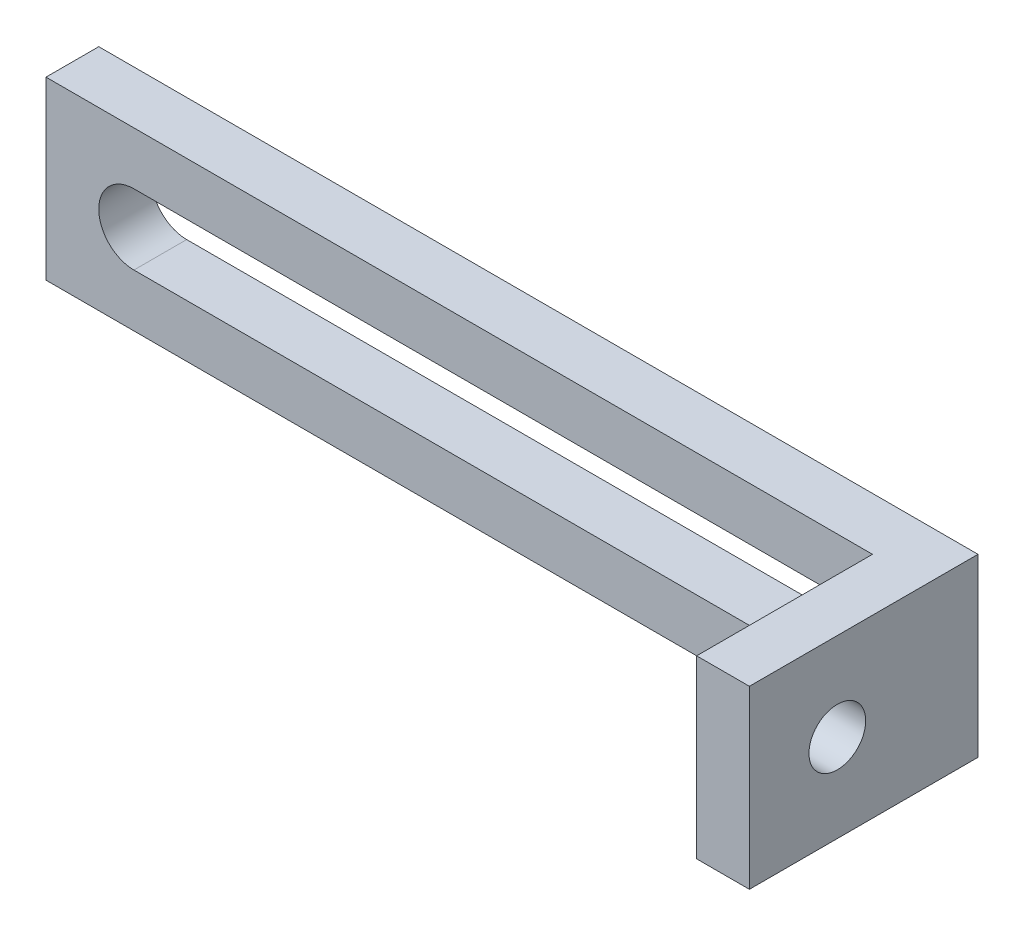
ISO-10303-21;
HEADER;
FILE_DESCRIPTION(('STEP AP214'),'2;1');
FILE_NAME('part.step','',(''),(''),'','','');
FILE_SCHEMA(('AUTOMOTIVE_DESIGN { 1 0 10303 214 1 1 1 1 }'));
ENDSEC;
DATA;
#1=APPLICATION_CONTEXT('core data for automotive mechanical design processes');
#2=APPLICATION_PROTOCOL_DEFINITION('international standard','automotive_design',2000,#1);
#3=PRODUCT_CONTEXT('',#1,'mechanical');
#4=PRODUCT('Part','Part','',(#3));
#5=PRODUCT_RELATED_PRODUCT_CATEGORY('part','',(#4));
#6=PRODUCT_DEFINITION_FORMATION('','',#4);
#7=PRODUCT_DEFINITION_CONTEXT('part definition',#1,'design');
#8=PRODUCT_DEFINITION('design','',#6,#7);
#9=PRODUCT_DEFINITION_SHAPE('','',#8);
#10=(LENGTH_UNIT() NAMED_UNIT(*) SI_UNIT(.MILLI.,.METRE.));
#11=(NAMED_UNIT(*) PLANE_ANGLE_UNIT() SI_UNIT($,.RADIAN.));
#12=(NAMED_UNIT(*) SI_UNIT($,.STERADIAN.) SOLID_ANGLE_UNIT());
#13=UNCERTAINTY_MEASURE_WITH_UNIT(LENGTH_MEASURE(1.E-05),#10,'distance_accuracy_value','');
#14=(GEOMETRIC_REPRESENTATION_CONTEXT(3) GLOBAL_UNCERTAINTY_ASSIGNED_CONTEXT((#13)) GLOBAL_UNIT_ASSIGNED_CONTEXT((#10,
#11,#12)) REPRESENTATION_CONTEXT('',''));
#15=CARTESIAN_POINT('',(0.,0.,0.));
#16=DIRECTION('',(0.,0.,1.));
#17=DIRECTION('',(1.,0.,0.));
#18=AXIS2_PLACEMENT_3D('',#15,#16,#17);
#19=CARTESIAN_POINT('',(25.,5.,3.));
#20=DIRECTION('',(-1.,0.,0.));
#21=DIRECTION('',(0.,0.,1.));
#22=AXIS2_PLACEMENT_3D('',#19,#20,#21);
#23=PLANE('',#22);
#24=CARTESIAN_POINT('',(25.,0.,8.));
#25=DIRECTION('',(1.,0.,0.));
#26=DIRECTION('',(0.,0.,-1.));
#27=AXIS2_PLACEMENT_3D('',#24,#25,#26);
#28=CIRCLE('',#27,1.61444520199689);
#29=CARTESIAN_POINT('',(25.,0.,6.38555479800312));
#30=VERTEX_POINT('',#29);
#31=EDGE_CURVE('E180',#30,#30,#28,.T.);
#32=ORIENTED_EDGE('',*,*,#31,.F.);
#33=EDGE_LOOP('',(#32));
#34=FACE_BOUND('',#33,.T.);
#35=DIRECTION('',(0.,1.,0.));
#36=VECTOR('',#35,1.);
#37=CARTESIAN_POINT('',(25.,5.,0.));
#38=LINE('',#37,#36);
#39=CARTESIAN_POINT('',(25.,-5.,0.));
#40=VERTEX_POINT('',#39);
#41=CARTESIAN_POINT('',(25.,5.,0.));
#42=VERTEX_POINT('',#41);
#43=EDGE_CURVE('E204',#40,#42,#38,.T.);
#44=ORIENTED_EDGE('',*,*,#43,.T.);
#45=DIRECTION('',(0.,0.,-1.));
#46=VECTOR('',#45,1.);
#47=CARTESIAN_POINT('',(25.,5.,3.));
#48=LINE('',#47,#46);
#49=CARTESIAN_POINT('',(25.,5.,13.));
#50=VERTEX_POINT('',#49);
#51=EDGE_CURVE('E229',#50,#42,#48,.T.);
#52=ORIENTED_EDGE('',*,*,#51,.F.);
#53=DIRECTION('',(0.,1.,0.));
#54=VECTOR('',#53,1.);
#55=CARTESIAN_POINT('',(25.,5.,13.));
#56=LINE('',#55,#54);
#57=CARTESIAN_POINT('',(25.,-5.,13.));
#58=VERTEX_POINT('',#57);
#59=EDGE_CURVE('E184',#58,#50,#56,.T.);
#60=ORIENTED_EDGE('',*,*,#59,.F.);
#61=DIRECTION('',(0.,0.,-1.));
#62=VECTOR('',#61,1.);
#63=CARTESIAN_POINT('',(25.,-5.,3.));
#64=LINE('',#63,#62);
#65=EDGE_CURVE('E213',#58,#40,#64,.T.);
#66=ORIENTED_EDGE('',*,*,#65,.T.);
#67=EDGE_LOOP('',(#44,#52,#60,#66));
#68=FACE_BOUND('',#67,.T.);
#69=ADVANCED_FACE('F34',(#34,#68),#23,.F.);
#70=CARTESIAN_POINT('',(-25.,5.,3.));
#71=DIRECTION('',(0.,-1.,0.));
#72=DIRECTION('',(0.,0.,-1.));
#73=AXIS2_PLACEMENT_3D('',#70,#71,#72);
#74=PLANE('',#73);
#75=DIRECTION('',(-1.,0.,0.));
#76=VECTOR('',#75,1.);
#77=CARTESIAN_POINT('',(-25.,5.,0.));
#78=LINE('',#77,#76);
#79=CARTESIAN_POINT('',(-25.,5.,0.));
#80=VERTEX_POINT('',#79);
#81=EDGE_CURVE('E216',#42,#80,#78,.T.);
#82=ORIENTED_EDGE('',*,*,#81,.T.);
#83=DIRECTION('',(0.,0.,-1.));
#84=VECTOR('',#83,1.);
#85=CARTESIAN_POINT('',(-25.,5.,3.));
#86=LINE('',#85,#84);
#87=CARTESIAN_POINT('',(-25.,5.,3.));
#88=VERTEX_POINT('',#87);
#89=EDGE_CURVE('E226',#88,#80,#86,.T.);
#90=ORIENTED_EDGE('',*,*,#89,.F.);
#91=DIRECTION('',(-1.,0.,0.));
#92=VECTOR('',#91,1.);
#93=CARTESIAN_POINT('',(-25.,5.,3.));
#94=LINE('',#93,#92);
#95=CARTESIAN_POINT('',(22.,5.,3.));
#96=VERTEX_POINT('',#95);
#97=EDGE_CURVE('E205',#96,#88,#94,.T.);
#98=ORIENTED_EDGE('',*,*,#97,.F.);
#99=DIRECTION('',(0.,0.,-1.));
#100=VECTOR('',#99,1.);
#101=CARTESIAN_POINT('',(22.,5.,13.));
#102=LINE('',#101,#100);
#103=CARTESIAN_POINT('',(22.,5.,13.));
#104=VERTEX_POINT('',#103);
#105=EDGE_CURVE('E201',#104,#96,#102,.T.);
#106=ORIENTED_EDGE('',*,*,#105,.F.);
#107=DIRECTION('',(-1.,0.,0.));
#108=VECTOR('',#107,1.);
#109=CARTESIAN_POINT('',(25.,5.,13.));
#110=LINE('',#109,#108);
#111=EDGE_CURVE('E187',#50,#104,#110,.T.);
#112=ORIENTED_EDGE('',*,*,#111,.F.);
#113=ORIENTED_EDGE('',*,*,#51,.T.);
#114=EDGE_LOOP('',(#82,#90,#98,#106,#112,#113));
#115=FACE_BOUND('',#114,.T.);
#116=ADVANCED_FACE('F270',(#115),#74,.F.);
#117=CARTESIAN_POINT('',(-25.,5.,3.));
#118=DIRECTION('',(1.,0.,0.));
#119=DIRECTION('',(0.,0.,-1.));
#120=AXIS2_PLACEMENT_3D('',#117,#118,#119);
#121=PLANE('',#120);
#122=DIRECTION('',(0.,-1.,0.));
#123=VECTOR('',#122,1.);
#124=CARTESIAN_POINT('',(-25.,5.,0.));
#125=LINE('',#124,#123);
#126=CARTESIAN_POINT('',(-25.,-5.,0.));
#127=VERTEX_POINT('',#126);
#128=EDGE_CURVE('E218',#80,#127,#125,.T.);
#129=ORIENTED_EDGE('',*,*,#128,.T.);
#130=DIRECTION('',(0.,0.,-1.));
#131=VECTOR('',#130,1.);
#132=CARTESIAN_POINT('',(-25.,-5.,3.));
#133=LINE('',#132,#131);
#134=CARTESIAN_POINT('',(-25.,-5.,3.));
#135=VERTEX_POINT('',#134);
#136=EDGE_CURVE('E223',#135,#127,#133,.T.);
#137=ORIENTED_EDGE('',*,*,#136,.F.);
#138=DIRECTION('',(0.,-1.,0.));
#139=VECTOR('',#138,1.);
#140=CARTESIAN_POINT('',(-25.,5.,3.));
#141=LINE('',#140,#139);
#142=EDGE_CURVE('E207',#88,#135,#141,.T.);
#143=ORIENTED_EDGE('',*,*,#142,.F.);
#144=ORIENTED_EDGE('',*,*,#89,.T.);
#145=EDGE_LOOP('',(#129,#137,#143,#144));
#146=FACE_BOUND('',#145,.T.);
#147=ADVANCED_FACE('F275',(#146),#121,.F.);
#148=CARTESIAN_POINT('',(-25.,-5.,3.));
#149=DIRECTION('',(0.,1.,0.));
#150=DIRECTION('',(0.,0.,1.));
#151=AXIS2_PLACEMENT_3D('',#148,#149,#150);
#152=PLANE('',#151);
#153=DIRECTION('',(1.,0.,0.));
#154=VECTOR('',#153,1.);
#155=CARTESIAN_POINT('',(-25.,-5.,0.));
#156=LINE('',#155,#154);
#157=EDGE_CURVE('E208',#127,#40,#156,.T.);
#158=ORIENTED_EDGE('',*,*,#157,.T.);
#159=ORIENTED_EDGE('',*,*,#65,.F.);
#160=DIRECTION('',(1.,0.,0.));
#161=VECTOR('',#160,1.);
#162=CARTESIAN_POINT('',(25.,-5.,13.));
#163=LINE('',#162,#161);
#164=CARTESIAN_POINT('',(22.,-5.,13.));
#165=VERTEX_POINT('',#164);
#166=EDGE_CURVE('E192',#165,#58,#163,.T.);
#167=ORIENTED_EDGE('',*,*,#166,.F.);
#168=DIRECTION('',(0.,0.,-1.));
#169=VECTOR('',#168,1.);
#170=CARTESIAN_POINT('',(22.,-5.,13.));
#171=LINE('',#170,#169);
#172=CARTESIAN_POINT('',(22.,-5.,3.));
#173=VERTEX_POINT('',#172);
#174=EDGE_CURVE('E195',#165,#173,#171,.T.);
#175=ORIENTED_EDGE('',*,*,#174,.T.);
#176=DIRECTION('',(1.,0.,0.));
#177=VECTOR('',#176,1.);
#178=CARTESIAN_POINT('',(-25.,-5.,3.));
#179=LINE('',#178,#177);
#180=EDGE_CURVE('E210',#135,#173,#179,.T.);
#181=ORIENTED_EDGE('',*,*,#180,.F.);
#182=ORIENTED_EDGE('',*,*,#136,.T.);
#183=EDGE_LOOP('',(#158,#159,#167,#175,#181,#182));
#184=FACE_BOUND('',#183,.T.);
#185=ADVANCED_FACE('F293',(#184),#152,.F.);
#186=CARTESIAN_POINT('',(0.,0.,3.));
#187=DIRECTION('',(0.,0.,1.));
#188=DIRECTION('',(1.,0.,0.));
#189=AXIS2_PLACEMENT_3D('',#186,#187,#188);
#190=PLANE('',#189);
#191=CARTESIAN_POINT('',(20.3063586632031,0.,3.));
#192=DIRECTION('',(0.,0.,1.));
#193=DIRECTION('',(1.,0.,0.));
#194=AXIS2_PLACEMENT_3D('',#191,#192,#193);
#195=CIRCLE('',#194,2.);
#196=CARTESIAN_POINT('',(20.3063586632031,-2.00000000000001,3.));
#197=VERTEX_POINT('',#196);
#198=CARTESIAN_POINT('',(22.,-1.06375703160684,3.));
#199=VERTEX_POINT('',#198);
#200=EDGE_CURVE('E173',#197,#199,#195,.T.);
#201=ORIENTED_EDGE('',*,*,#200,.F.);
#202=DIRECTION('',(1.,0.,0.));
#203=VECTOR('',#202,1.);
#204=CARTESIAN_POINT('',(0.,-2.,3.));
#205=LINE('',#204,#203);
#206=CARTESIAN_POINT('',(-20.,-2.,3.));
#207=VERTEX_POINT('',#206);
#208=EDGE_CURVE('E176',#207,#197,#205,.T.);
#209=ORIENTED_EDGE('',*,*,#208,.F.);
#210=CARTESIAN_POINT('',(-20.,0.,3.));
#211=DIRECTION('',(0.,0.,1.));
#212=DIRECTION('',(1.,0.,0.));
#213=AXIS2_PLACEMENT_3D('',#210,#211,#212);
#214=CIRCLE('',#213,2.);
#215=CARTESIAN_POINT('',(-20.,2.,3.));
#216=VERTEX_POINT('',#215);
#217=EDGE_CURVE('E178',#216,#207,#214,.T.);
#218=ORIENTED_EDGE('',*,*,#217,.F.);
#219=DIRECTION('',(-1.,0.,0.));
#220=VECTOR('',#219,1.);
#221=CARTESIAN_POINT('',(0.,2.,3.));
#222=LINE('',#221,#220);
#223=CARTESIAN_POINT('',(20.3063586632031,1.99999999999999,3.));
#224=VERTEX_POINT('',#223);
#225=EDGE_CURVE('E174',#224,#216,#222,.T.);
#226=ORIENTED_EDGE('',*,*,#225,.F.);
#227=CARTESIAN_POINT('',(22.,1.06375703160682,3.));
#228=VERTEX_POINT('',#227);
#229=EDGE_CURVE('E141',#228,#224,#195,.T.);
#230=ORIENTED_EDGE('',*,*,#229,.F.);
#231=DIRECTION('',(0.,-1.,0.));
#232=VECTOR('',#231,1.);
#233=CARTESIAN_POINT('',(22.,5.,3.));
#234=LINE('',#233,#232);
#235=EDGE_CURVE('E188',#96,#228,#234,.T.);
#236=ORIENTED_EDGE('',*,*,#235,.F.);
#237=ORIENTED_EDGE('',*,*,#97,.T.);
#238=ORIENTED_EDGE('',*,*,#142,.T.);
#239=ORIENTED_EDGE('',*,*,#180,.T.);
#240=EDGE_CURVE('E198',#199,#173,#234,.T.);
#241=ORIENTED_EDGE('',*,*,#240,.F.);
#242=EDGE_LOOP('',(#201,#209,#218,#226,#230,#236,#237,#238,#239,#241));
#243=FACE_BOUND('',#242,.T.);
#244=ADVANCED_FACE('F305',(#243),#190,.T.);
#245=CARTESIAN_POINT('',(0.,0.,0.));
#246=DIRECTION('',(0.,0.,1.));
#247=DIRECTION('',(1.,0.,0.));
#248=AXIS2_PLACEMENT_3D('',#245,#246,#247);
#249=PLANE('',#248);
#250=DIRECTION('',(1.,0.,0.));
#251=VECTOR('',#250,1.);
#252=CARTESIAN_POINT('',(-20.,2.,0.));
#253=LINE('',#252,#251);
#254=CARTESIAN_POINT('',(-20.,2.,0.));
#255=VERTEX_POINT('',#254);
#256=CARTESIAN_POINT('',(20.3063586632031,1.99999999999999,0.));
#257=VERTEX_POINT('',#256);
#258=EDGE_CURVE('E148',#255,#257,#253,.T.);
#259=ORIENTED_EDGE('',*,*,#258,.F.);
#260=CARTESIAN_POINT('',(-20.,0.,0.));
#261=DIRECTION('',(0.,0.,-1.));
#262=DIRECTION('',(-1.,0.,0.));
#263=AXIS2_PLACEMENT_3D('',#260,#261,#262);
#264=CIRCLE('',#263,2.);
#265=CARTESIAN_POINT('',(-20.,-2.,0.));
#266=VERTEX_POINT('',#265);
#267=EDGE_CURVE('E48',#266,#255,#264,.T.);
#268=ORIENTED_EDGE('',*,*,#267,.F.);
#269=DIRECTION('',(-1.,0.,0.));
#270=VECTOR('',#269,1.);
#271=CARTESIAN_POINT('',(-20.,-2.,0.));
#272=LINE('',#271,#270);
#273=CARTESIAN_POINT('',(20.3063586632031,-2.00000000000001,0.));
#274=VERTEX_POINT('',#273);
#275=EDGE_CURVE('E155',#274,#266,#272,.T.);
#276=ORIENTED_EDGE('',*,*,#275,.F.);
#277=CARTESIAN_POINT('',(20.3063586632031,0.,0.));
#278=DIRECTION('',(0.,0.,-1.));
#279=DIRECTION('',(-1.,0.,0.));
#280=AXIS2_PLACEMENT_3D('',#277,#278,#279);
#281=CIRCLE('',#280,2.);
#282=EDGE_CURVE('E138',#257,#274,#281,.T.);
#283=ORIENTED_EDGE('',*,*,#282,.F.);
#284=EDGE_LOOP('',(#259,#268,#276,#283));
#285=FACE_BOUND('',#284,.T.);
#286=ORIENTED_EDGE('',*,*,#43,.F.);
#287=ORIENTED_EDGE('',*,*,#157,.F.);
#288=ORIENTED_EDGE('',*,*,#128,.F.);
#289=ORIENTED_EDGE('',*,*,#81,.F.);
#290=EDGE_LOOP('',(#286,#287,#288,#289));
#291=FACE_BOUND('',#290,.T.);
#292=ADVANCED_FACE('F152',(#285,#291),#249,.F.);
#293=CARTESIAN_POINT('',(22.,5.,13.));
#294=DIRECTION('',(1.,0.,0.));
#295=DIRECTION('',(0.,1.,0.));
#296=AXIS2_PLACEMENT_3D('',#293,#294,#295);
#297=PLANE('',#296);
#298=CARTESIAN_POINT('',(22.,0.,8.));
#299=DIRECTION('',(1.,0.,0.));
#300=DIRECTION('',(0.,1.,0.));
#301=AXIS2_PLACEMENT_3D('',#298,#299,#300);
#302=CIRCLE('',#301,1.61444520199689);
#303=CARTESIAN_POINT('',(22.,-1.06375703160684,9.21443578996906));
#304=VERTEX_POINT('',#303);
#305=CARTESIAN_POINT('',(22.,-1.06375703160684,6.78556421003094));
#306=VERTEX_POINT('',#305);
#307=EDGE_CURVE('E235',#304,#306,#302,.T.);
#308=ORIENTED_EDGE('',*,*,#307,.T.);
#309=DIRECTION('',(0.,0.,-1.));
#310=VECTOR('',#309,1.);
#311=CARTESIAN_POINT('',(22.,-1.06375703160684,10.));
#312=LINE('',#311,#310);
#313=EDGE_CURVE('E56',#306,#199,#312,.T.);
#314=ORIENTED_EDGE('',*,*,#313,.T.);
#315=ORIENTED_EDGE('',*,*,#240,.T.);
#316=ORIENTED_EDGE('',*,*,#174,.F.);
#317=DIRECTION('',(0.,-1.,0.));
#318=VECTOR('',#317,1.);
#319=CARTESIAN_POINT('',(22.,5.,13.));
#320=LINE('',#319,#318);
#321=EDGE_CURVE('E190',#104,#165,#320,.T.);
#322=ORIENTED_EDGE('',*,*,#321,.F.);
#323=ORIENTED_EDGE('',*,*,#105,.T.);
#324=ORIENTED_EDGE('',*,*,#235,.T.);
#325=DIRECTION('',(0.,0.,-1.));
#326=VECTOR('',#325,1.);
#327=CARTESIAN_POINT('',(22.,1.06375703160682,10.));
#328=LINE('',#327,#326);
#329=CARTESIAN_POINT('',(22.,1.06375703160683,6.78556421003093));
#330=VERTEX_POINT('',#329);
#331=EDGE_CURVE('E169',#228,#330,#328,.F.);
#332=ORIENTED_EDGE('',*,*,#331,.T.);
#333=CARTESIAN_POINT('',(22.,1.06375703160682,9.21443578996907));
#334=VERTEX_POINT('',#333);
#335=EDGE_CURVE('E183',#330,#334,#302,.T.);
#336=ORIENTED_EDGE('',*,*,#335,.T.);
#337=CARTESIAN_POINT('',(22.,1.06375703160682,10.));
#338=VERTEX_POINT('',#337);
#339=EDGE_CURVE('E163',#334,#338,#328,.F.);
#340=ORIENTED_EDGE('',*,*,#339,.T.);
#341=DIRECTION('',(0.,1.,0.));
#342=VECTOR('',#341,1.);
#343=CARTESIAN_POINT('',(22.,5.,10.));
#344=LINE('',#343,#342);
#345=CARTESIAN_POINT('',(22.,-1.06375703160683,10.));
#346=VERTEX_POINT('',#345);
#347=EDGE_CURVE('E11',#346,#338,#344,.T.);
#348=ORIENTED_EDGE('',*,*,#347,.F.);
#349=EDGE_CURVE('E168',#346,#304,#312,.T.);
#350=ORIENTED_EDGE('',*,*,#349,.T.);
#351=EDGE_LOOP('',(#308,#314,#315,#316,#322,#323,#324,#332,#336,#340,#348,#350));
#352=FACE_BOUND('',#351,.T.);
#353=ADVANCED_FACE('F301',(#352),#297,.F.);
#354=CARTESIAN_POINT('',(0.,0.,13.));
#355=DIRECTION('',(0.,0.,-1.));
#356=DIRECTION('',(-1.,0.,0.));
#357=AXIS2_PLACEMENT_3D('',#354,#355,#356);
#358=PLANE('',#357);
#359=ORIENTED_EDGE('',*,*,#59,.T.);
#360=ORIENTED_EDGE('',*,*,#111,.T.);
#361=ORIENTED_EDGE('',*,*,#321,.T.);
#362=ORIENTED_EDGE('',*,*,#166,.T.);
#363=EDGE_LOOP('',(#359,#360,#361,#362));
#364=FACE_BOUND('',#363,.T.);
#365=ADVANCED_FACE('F289',(#364),#358,.F.);
#366=CARTESIAN_POINT('',(15.,0.,8.));
#367=DIRECTION('',(1.,0.,0.));
#368=DIRECTION('',(0.,0.,-1.));
#369=AXIS2_PLACEMENT_3D('',#366,#367,#368);
#370=CYLINDRICAL_SURFACE('',#369,1.61444520199689);
#371=ORIENTED_EDGE('',*,*,#31,.T.);
#372=EDGE_LOOP('',(#371));
#373=FACE_BOUND('',#372,.T.);
#374=ORIENTED_EDGE('',*,*,#335,.F.);
#375=CARTESIAN_POINT('',(22.,1.06375703160683,6.78556421003093));
#376=CARTESIAN_POINT('',(22.0188032996192,1.03381779376546,6.75934658014459));
#377=CARTESIAN_POINT('',(22.0371932865215,1.00277613514509,6.73410685869977));
#378=CARTESIAN_POINT('',(22.0728924472153,0.938464249355861,6.68571504199958));
#379=CARTESIAN_POINT('',(22.0902005090884,0.905191800019928,6.66256508393479));
#380=CARTESIAN_POINT('',(22.1403372994411,0.801520718467143,6.59616221636716));
#381=CARTESIAN_POINT('',(22.1710593589866,0.727762023153986,6.5563941620353));
#382=CARTESIAN_POINT('',(22.224611011303,0.571955829906876,6.48785433016536));
#383=CARTESIAN_POINT('',(22.2473889481113,0.489858406041804,6.45915439912254));
#384=CARTESIAN_POINT('',(22.2824293375989,0.320277688968936,6.41523955628508));
#385=CARTESIAN_POINT('',(22.2947384398989,0.232820170648809,6.39996481094056));
#386=CARTESIAN_POINT('',(22.306663614611,0.0680807695746305,6.38517276977889));
#387=CARTESIAN_POINT('',(22.307806587024,-0.00892516031450702,6.3837598238655));
#388=CARTESIAN_POINT('',(22.3012570572439,-0.162002031900135,6.39187711757424));
#389=CARTESIAN_POINT('',(22.2935621382524,-0.238072712093832,6.40141035052433));
#390=CARTESIAN_POINT('',(22.2708955628558,-0.381423778340448,6.42968040637981));
#391=CARTESIAN_POINT('',(22.2564930947699,-0.448941298222054,6.44769837353341));
#392=CARTESIAN_POINT('',(22.2216762135911,-0.579786555494483,6.49167223706617));
#393=CARTESIAN_POINT('',(22.2012525554064,-0.643107665127184,6.51764034266953));
#394=CARTESIAN_POINT('',(22.153329166256,-0.77057257895244,6.57938054355527));
#395=CARTESIAN_POINT('',(22.1253283470637,-0.834174393818409,6.61586984209543));
#396=CARTESIAN_POINT('',(22.0652923147667,-0.954290737378084,6.69579873443961));
#397=CARTESIAN_POINT('',(22.0332766104008,-1.01083706343202,6.73920497706659));
#398=CARTESIAN_POINT('',(22.,-1.06375703160684,6.78556421003094));
#399=B_SPLINE_CURVE_WITH_KNOTS('',3,(#375,#376,#377,#378,#379,#380,#381,#382,#383,#384,#385,
#386,#387,#388,#389,#390,#391,#392,#393,#394,#395,#396,#397,#398),.UNSPECIFIED.,.F.,.F.,(4,2,2,
2,2,2,2,2,2,2,2,4),(0.,0.131991413518058,0.264116319878657,0.530542743696974,0.798670624341733,
1.06559735932172,1.29540996218965,1.52528542428574,1.73846264141166,1.95196889639105,
2.18666370612377,2.42025935264319),.UNSPECIFIED.);
#400=EDGE_CURVE('E41',#330,#306,#399,.T.);
#401=ORIENTED_EDGE('',*,*,#400,.T.);
#402=ORIENTED_EDGE('',*,*,#307,.F.);
#403=CARTESIAN_POINT('',(22.,-1.06375703160684,9.21443578996906));
#404=CARTESIAN_POINT('',(22.0188032996192,-1.03381779376547,9.2406534198554));
#405=CARTESIAN_POINT('',(22.0371932865215,-1.0027761351451,9.26589314130023));
#406=CARTESIAN_POINT('',(22.0728924472153,-0.938464249355872,9.31428495800041));
#407=CARTESIAN_POINT('',(22.0902005090884,-0.905191800019939,9.3374349160652));
#408=CARTESIAN_POINT('',(22.1403372994411,-0.801520718467154,9.40383778363283));
#409=CARTESIAN_POINT('',(22.1710593589866,-0.727762023153998,9.4436058379647));
#410=CARTESIAN_POINT('',(22.224611011303,-0.571955829906889,9.51214566983463));
#411=CARTESIAN_POINT('',(22.2473889481113,-0.489858406041817,9.54084560087746));
#412=CARTESIAN_POINT('',(22.2824293375989,-0.320277688968949,9.58476044371492));
#413=CARTESIAN_POINT('',(22.2947384398989,-0.232820170648822,9.60003518905944));
#414=CARTESIAN_POINT('',(22.306663614611,-0.0680807695746423,9.61482723022111));
#415=CARTESIAN_POINT('',(22.307806587024,0.00892516031449546,9.6162401761345));
#416=CARTESIAN_POINT('',(22.3012570572439,0.162002031900123,9.60812288242576));
#417=CARTESIAN_POINT('',(22.2935621382524,0.238072712093821,9.59858964947567));
#418=CARTESIAN_POINT('',(22.2708955628558,0.381423778340438,9.57031959362019));
#419=CARTESIAN_POINT('',(22.2564930947699,0.448941298222045,9.55230162646659));
#420=CARTESIAN_POINT('',(22.2216762135911,0.579786555494474,9.50832776293384));
#421=CARTESIAN_POINT('',(22.2012525554064,0.643107665127174,9.48235965733047));
#422=CARTESIAN_POINT('',(22.153329166256,0.770572578952429,9.42061945644474));
#423=CARTESIAN_POINT('',(22.1253283470637,0.834174393818398,9.38413015790457));
#424=CARTESIAN_POINT('',(22.0652923147667,0.954290737378073,9.30420126556039));
#425=CARTESIAN_POINT('',(22.0332766104008,1.01083706343201,9.26079502293342));
#426=CARTESIAN_POINT('',(22.,1.06375703160683,9.21443578996907));
#427=B_SPLINE_CURVE_WITH_KNOTS('',3,(#403,#404,#405,#406,#407,#408,#409,#410,#411,#412,#413,
#414,#415,#416,#417,#418,#419,#420,#421,#422,#423,#424,#425,#426),.UNSPECIFIED.,.F.,.F.,(4,2,2,
2,2,2,2,2,2,2,2,4),(0.,0.131991413518059,0.264116319878659,0.530542743696976,0.798670624341734,
1.06559735932172,1.29540996218965,1.52528542428575,1.73846264141167,1.95196889639105,
2.18666370612377,2.42025935264319),.UNSPECIFIED.);
#428=EDGE_CURVE('E232',#304,#334,#427,.T.);
#429=ORIENTED_EDGE('',*,*,#428,.T.);
#430=EDGE_LOOP('',(#374,#401,#402,#429));
#431=FACE_BOUND('',#430,.T.);
#432=ADVANCED_FACE('F247',(#373,#431),#370,.F.);
#433=CARTESIAN_POINT('',(20.3063586632031,0.,10.));
#434=DIRECTION('',(0.,0.,-1.));
#435=DIRECTION('',(-1.,0.,0.));
#436=AXIS2_PLACEMENT_3D('',#433,#434,#435);
#437=CYLINDRICAL_SURFACE('',#436,2.);
#438=CARTESIAN_POINT('',(20.3063586632031,0.,10.));
#439=DIRECTION('',(0.,0.,-1.));
#440=DIRECTION('',(-1.,0.,0.));
#441=AXIS2_PLACEMENT_3D('',#438,#439,#440);
#442=CIRCLE('',#441,2.);
#443=EDGE_CURVE('E157',#338,#346,#442,.T.);
#444=ORIENTED_EDGE('',*,*,#443,.F.);
#445=ORIENTED_EDGE('',*,*,#339,.F.);
#446=ORIENTED_EDGE('',*,*,#428,.F.);
#447=ORIENTED_EDGE('',*,*,#349,.F.);
#448=EDGE_LOOP('',(#444,#445,#446,#447));
#449=FACE_BOUND('',#448,.T.);
#450=ADVANCED_FACE('F256',(#449),#437,.F.);
#451=CARTESIAN_POINT('',(-20.,0.,10.));
#452=DIRECTION('',(0.,0.,-1.));
#453=DIRECTION('',(-1.,0.,0.));
#454=AXIS2_PLACEMENT_3D('',#451,#452,#453);
#455=PLANE('',#454);
#456=ORIENTED_EDGE('',*,*,#347,.T.);
#457=ORIENTED_EDGE('',*,*,#443,.T.);
#458=EDGE_LOOP('',(#456,#457));
#459=FACE_BOUND('',#458,.T.);
#460=ADVANCED_FACE('F262',(#459),#455,.T.);
#461=CARTESIAN_POINT('',(-20.,0.,10.));
#462=DIRECTION('',(0.,0.,-1.));
#463=DIRECTION('',(-1.,0.,0.));
#464=AXIS2_PLACEMENT_3D('',#461,#462,#463);
#465=CYLINDRICAL_SURFACE('',#464,2.);
#466=ORIENTED_EDGE('',*,*,#217,.T.);
#467=DIRECTION('',(0.,0.,-1.));
#468=VECTOR('',#467,1.);
#469=CARTESIAN_POINT('',(-20.,-2.,10.));
#470=LINE('',#469,#468);
#471=EDGE_CURVE('E161',#207,#266,#470,.T.);
#472=ORIENTED_EDGE('',*,*,#471,.T.);
#473=ORIENTED_EDGE('',*,*,#267,.T.);
#474=DIRECTION('',(0.,0.,-1.));
#475=VECTOR('',#474,1.);
#476=CARTESIAN_POINT('',(-20.,2.,10.));
#477=LINE('',#476,#475);
#478=EDGE_CURVE('E145',#216,#255,#477,.T.);
#479=ORIENTED_EDGE('',*,*,#478,.F.);
#480=EDGE_LOOP('',(#466,#472,#473,#479));
#481=FACE_BOUND('',#480,.T.);
#482=ADVANCED_FACE('F260',(#481),#465,.F.);
#483=CARTESIAN_POINT('',(-20.,-2.,10.));
#484=DIRECTION('',(0.,-1.,0.));
#485=DIRECTION('',(1.,0.,0.));
#486=AXIS2_PLACEMENT_3D('',#483,#484,#485);
#487=PLANE('',#486);
#488=ORIENTED_EDGE('',*,*,#208,.T.);
#489=DIRECTION('',(0.,0.,-1.));
#490=VECTOR('',#489,1.);
#491=CARTESIAN_POINT('',(20.3063586632031,-2.00000000000001,10.));
#492=LINE('',#491,#490);
#493=EDGE_CURVE('E144',#197,#274,#492,.T.);
#494=ORIENTED_EDGE('',*,*,#493,.T.);
#495=ORIENTED_EDGE('',*,*,#275,.T.);
#496=ORIENTED_EDGE('',*,*,#471,.F.);
#497=EDGE_LOOP('',(#488,#494,#495,#496));
#498=FACE_BOUND('',#497,.T.);
#499=ADVANCED_FACE('F255',(#498),#487,.F.);
#500=ORIENTED_EDGE('',*,*,#200,.T.);
#501=ORIENTED_EDGE('',*,*,#313,.F.);
#502=ORIENTED_EDGE('',*,*,#400,.F.);
#503=ORIENTED_EDGE('',*,*,#331,.F.);
#504=ORIENTED_EDGE('',*,*,#229,.T.);
#505=DIRECTION('',(0.,0.,-1.));
#506=VECTOR('',#505,1.);
#507=CARTESIAN_POINT('',(20.3063586632031,1.99999999999999,10.));
#508=LINE('',#507,#506);
#509=EDGE_CURVE('E133',#224,#257,#508,.T.);
#510=ORIENTED_EDGE('',*,*,#509,.T.);
#511=ORIENTED_EDGE('',*,*,#282,.T.);
#512=ORIENTED_EDGE('',*,*,#493,.F.);
#513=EDGE_LOOP('',(#500,#501,#502,#503,#504,#510,#511,#512));
#514=FACE_BOUND('',#513,.T.);
#515=ADVANCED_FACE('F135',(#514),#437,.F.);
#516=CARTESIAN_POINT('',(-20.,2.,10.));
#517=DIRECTION('',(0.,1.,0.));
#518=DIRECTION('',(-1.,0.,0.));
#519=AXIS2_PLACEMENT_3D('',#516,#517,#518);
#520=PLANE('',#519);
#521=ORIENTED_EDGE('',*,*,#225,.T.);
#522=ORIENTED_EDGE('',*,*,#478,.T.);
#523=ORIENTED_EDGE('',*,*,#258,.T.);
#524=ORIENTED_EDGE('',*,*,#509,.F.);
#525=EDGE_LOOP('',(#521,#522,#523,#524));
#526=FACE_BOUND('',#525,.T.);
#527=ADVANCED_FACE('F149',(#526),#520,.F.);
#528=CLOSED_SHELL('',(#69,#116,#147,#185,#244,#292,#353,#365,#432,#450,#460,#482,#499,#515,#527));
#529=MANIFOLD_SOLID_BREP('B2',#528);
#530=ADVANCED_BREP_SHAPE_REPRESENTATION('',(#18,#529),#14);
#531=SHAPE_DEFINITION_REPRESENTATION(#9,#530);
ENDSEC;
END-ISO-10303-21;
